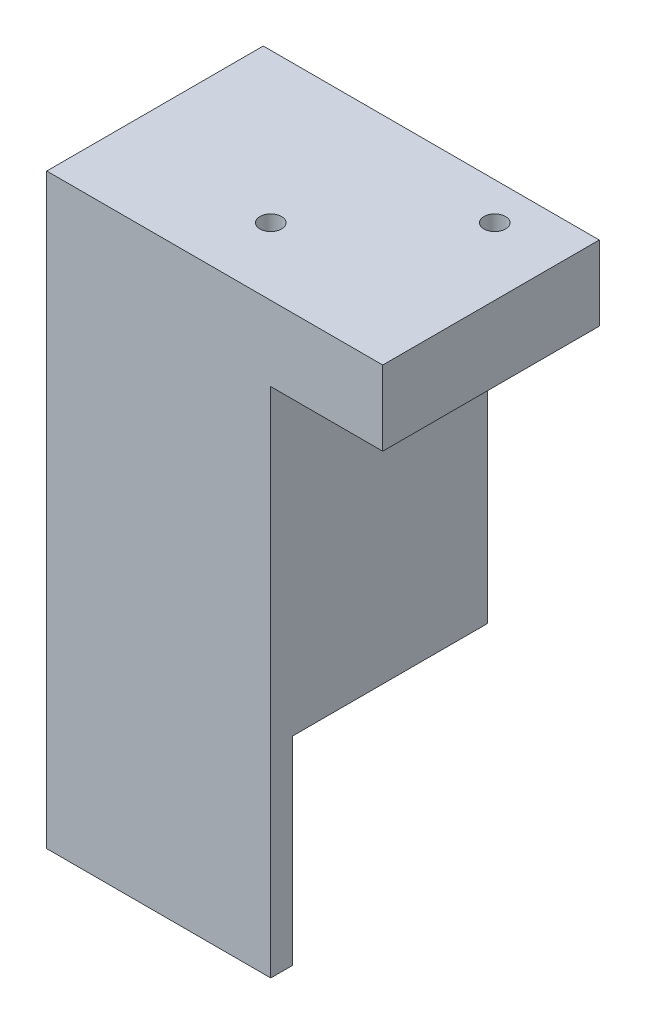
ISO-10303-21;
HEADER;
FILE_DESCRIPTION(('STEP AP214'),'2;1');
FILE_NAME('part.step','',(''),(''),'','','');
FILE_SCHEMA(('AUTOMOTIVE_DESIGN { 1 0 10303 214 1 1 1 1 }'));
ENDSEC;
DATA;
#1=APPLICATION_CONTEXT('core data for automotive mechanical design processes');
#2=APPLICATION_PROTOCOL_DEFINITION('international standard','automotive_design',2000,#1);
#3=PRODUCT_CONTEXT('',#1,'mechanical');
#4=PRODUCT('Part','Part','',(#3));
#5=PRODUCT_RELATED_PRODUCT_CATEGORY('part','',(#4));
#6=PRODUCT_DEFINITION_FORMATION('','',#4);
#7=PRODUCT_DEFINITION_CONTEXT('part definition',#1,'design');
#8=PRODUCT_DEFINITION('design','',#6,#7);
#9=PRODUCT_DEFINITION_SHAPE('','',#8);
#10=(LENGTH_UNIT() NAMED_UNIT(*) SI_UNIT(.MILLI.,.METRE.));
#11=(NAMED_UNIT(*) PLANE_ANGLE_UNIT() SI_UNIT($,.RADIAN.));
#12=(NAMED_UNIT(*) SI_UNIT($,.STERADIAN.) SOLID_ANGLE_UNIT());
#13=UNCERTAINTY_MEASURE_WITH_UNIT(LENGTH_MEASURE(1.E-05),#10,'distance_accuracy_value','');
#14=(GEOMETRIC_REPRESENTATION_CONTEXT(3) GLOBAL_UNCERTAINTY_ASSIGNED_CONTEXT((#13)) GLOBAL_UNIT_ASSIGNED_CONTEXT((#10,
#11,#12)) REPRESENTATION_CONTEXT('',''));
#15=CARTESIAN_POINT('',(0.,0.,0.));
#16=DIRECTION('',(0.,0.,1.));
#17=DIRECTION('',(1.,0.,0.));
#18=AXIS2_PLACEMENT_3D('',#15,#16,#17);
#19=CARTESIAN_POINT('',(0.,0.,-6.));
#20=DIRECTION('',(0.,0.,-1.));
#21=DIRECTION('',(1.,0.,0.));
#22=AXIS2_PLACEMENT_3D('',#19,#20,#21);
#23=PLANE('',#22);
#24=CARTESIAN_POINT('',(13.,40.,-6.));
#25=DIRECTION('',(0.,0.,1.));
#26=DIRECTION('',(1.,0.,0.));
#27=AXIS2_PLACEMENT_3D('',#24,#25,#26);
#28=CIRCLE('',#27,4.1);
#29=CARTESIAN_POINT('',(17.1,40.,-6.));
#30=VERTEX_POINT('',#29);
#31=EDGE_CURVE('E454',#30,#30,#28,.T.);
#32=ORIENTED_EDGE('',*,*,#31,.T.);
#33=EDGE_LOOP('',(#32));
#34=FACE_BOUND('',#33,.T.);
#35=DIRECTION('',(0.,-1.,0.));
#36=VECTOR('',#35,1.);
#37=CARTESIAN_POINT('',(0.,72.,-6.));
#38=LINE('',#37,#36);
#39=CARTESIAN_POINT('',(0.,72.,-6.));
#40=VERTEX_POINT('',#39);
#41=CARTESIAN_POINT('',(0.,-6.6,-6.));
#42=VERTEX_POINT('',#41);
#43=EDGE_CURVE('E354',#40,#42,#38,.T.);
#44=ORIENTED_EDGE('',*,*,#43,.F.);
#45=DIRECTION('',(-1.,0.,0.));
#46=VECTOR('',#45,1.);
#47=CARTESIAN_POINT('',(45.0000000000006,72.,-6.));
#48=LINE('',#47,#46);
#49=CARTESIAN_POINT('',(45.0000000000006,72.,-6.));
#50=VERTEX_POINT('',#49);
#51=EDGE_CURVE('E475',#50,#40,#48,.T.);
#52=ORIENTED_EDGE('',*,*,#51,.F.);
#53=DIRECTION('',(0.,1.,0.));
#54=VECTOR('',#53,1.);
#55=CARTESIAN_POINT('',(45.0000000000006,62.,-6.));
#56=LINE('',#55,#54);
#57=CARTESIAN_POINT('',(45.0000000000006,62.,-6.));
#58=VERTEX_POINT('',#57);
#59=EDGE_CURVE('E472',#58,#50,#56,.T.);
#60=ORIENTED_EDGE('',*,*,#59,.F.);
#61=DIRECTION('',(1.,0.,0.));
#62=VECTOR('',#61,1.);
#63=CARTESIAN_POINT('',(30.,62.,-6.));
#64=LINE('',#63,#62);
#65=CARTESIAN_POINT('',(30.,62.,-6.));
#66=VERTEX_POINT('',#65);
#67=EDGE_CURVE('E469',#66,#58,#64,.T.);
#68=ORIENTED_EDGE('',*,*,#67,.F.);
#69=DIRECTION('',(0.,1.,0.));
#70=VECTOR('',#69,1.);
#71=CARTESIAN_POINT('',(30.,20.,-6.));
#72=LINE('',#71,#70);
#73=CARTESIAN_POINT('',(30.,20.,-6.));
#74=VERTEX_POINT('',#73);
#75=EDGE_CURVE('E466',#74,#66,#72,.T.);
#76=ORIENTED_EDGE('',*,*,#75,.F.);
#77=DIRECTION('',(1.,0.,0.));
#78=VECTOR('',#77,1.);
#79=CARTESIAN_POINT('',(3.,20.,-6.));
#80=LINE('',#79,#78);
#81=CARTESIAN_POINT('',(2.9,20.,-6.));
#82=VERTEX_POINT('',#81);
#83=EDGE_CURVE('E463',#82,#74,#80,.T.);
#84=ORIENTED_EDGE('',*,*,#83,.F.);
#85=DIRECTION('',(0.,-1.,0.));
#86=VECTOR('',#85,1.);
#87=CARTESIAN_POINT('',(2.9,34.1003546051186,-6.));
#88=LINE('',#87,#86);
#89=CARTESIAN_POINT('',(2.9,-6.6,-6.));
#90=VERTEX_POINT('',#89);
#91=EDGE_CURVE('E421',#82,#90,#88,.T.);
#92=ORIENTED_EDGE('',*,*,#91,.T.);
#93=DIRECTION('',(-1.,0.,0.));
#94=VECTOR('',#93,1.);
#95=CARTESIAN_POINT('',(2.9,-6.6,-6.));
#96=LINE('',#95,#94);
#97=EDGE_CURVE('E356',#90,#42,#96,.T.);
#98=ORIENTED_EDGE('',*,*,#97,.T.);
#99=EDGE_LOOP('',(#44,#52,#60,#68,#76,#84,#92,#98));
#100=FACE_BOUND('',#99,.T.);
#101=ADVANCED_FACE('F43',(#34,#100),#23,.T.);
#102=CARTESIAN_POINT('',(13.,40.,6.));
#103=DIRECTION('',(0.,0.,-1.));
#104=DIRECTION('',(1.,0.,0.));
#105=AXIS2_PLACEMENT_3D('',#102,#103,#104);
#106=CYLINDRICAL_SURFACE('',#105,4.1);
#107=CARTESIAN_POINT('',(13.,40.,6.));
#108=DIRECTION('',(0.,0.,1.));
#109=DIRECTION('',(1.,0.,0.));
#110=AXIS2_PLACEMENT_3D('',#107,#108,#109);
#111=CIRCLE('',#110,4.1);
#112=CARTESIAN_POINT('',(17.1,40.,6.));
#113=VERTEX_POINT('',#112);
#114=EDGE_CURVE('E327',#113,#113,#111,.T.);
#115=ORIENTED_EDGE('',*,*,#114,.T.);
#116=EDGE_LOOP('',(#115));
#117=FACE_BOUND('',#116,.T.);
#118=ORIENTED_EDGE('',*,*,#31,.F.);
#119=EDGE_LOOP('',(#118));
#120=FACE_BOUND('',#119,.T.);
#121=ADVANCED_FACE('F595',(#117,#120),#106,.F.);
#122=CARTESIAN_POINT('',(13.,40.,6.));
#123=DIRECTION('',(0.,0.,-1.));
#124=DIRECTION('',(1.,0.,0.));
#125=AXIS2_PLACEMENT_3D('',#122,#123,#124);
#126=PLANE('',#125);
#127=ORIENTED_EDGE('',*,*,#114,.F.);
#128=EDGE_LOOP('',(#127));
#129=FACE_BOUND('',#128,.T.);
#130=ADVANCED_FACE('F601',(#129),#126,.T.);
#131=CARTESIAN_POINT('',(23.,-12.1313643090702,15.2999999996485));
#132=DIRECTION('',(0.,0.,1.));
#133=DIRECTION('',(-1.,0.,0.));
#134=AXIS2_PLACEMENT_3D('',#131,#132,#133);
#135=PLANE('',#134);
#136=DIRECTION('',(0.,1.,0.));
#137=VECTOR('',#136,1.);
#138=CARTESIAN_POINT('',(6.26715728747304,-12.1313643090702,15.2999999996485));
#139=LINE('',#138,#137);
#140=CARTESIAN_POINT('',(6.26715728747304,-6.6,15.2999999996485));
#141=VERTEX_POINT('',#140);
#142=CARTESIAN_POINT('',(6.26715728747304,20.,15.2999999996485));
#143=VERTEX_POINT('',#142);
#144=EDGE_CURVE('E494',#141,#143,#139,.T.);
#145=ORIENTED_EDGE('',*,*,#144,.T.);
#146=DIRECTION('',(-1.,0.,0.));
#147=VECTOR('',#146,1.);
#148=CARTESIAN_POINT('',(23.,20.,15.2999999996485));
#149=LINE('',#148,#147);
#150=CARTESIAN_POINT('',(4.69999999994772,20.,15.2999999996485));
#151=VERTEX_POINT('',#150);
#152=EDGE_CURVE('E261',#143,#151,#149,.T.);
#153=ORIENTED_EDGE('',*,*,#152,.T.);
#154=DIRECTION('',(0.,1.,0.));
#155=VECTOR('',#154,1.);
#156=CARTESIAN_POINT('',(4.69999999994772,-12.1313643090702,15.2999999996485));
#157=LINE('',#156,#155);
#158=CARTESIAN_POINT('',(4.69999999994772,-6.6,15.2999999996485));
#159=VERTEX_POINT('',#158);
#160=EDGE_CURVE('E274',#159,#151,#157,.T.);
#161=ORIENTED_EDGE('',*,*,#160,.F.);
#162=DIRECTION('',(1.,0.,0.));
#163=VECTOR('',#162,1.);
#164=CARTESIAN_POINT('',(4.69999999994772,-6.6,15.2999999996485));
#165=LINE('',#164,#163);
#166=EDGE_CURVE('E403',#159,#141,#165,.T.);
#167=ORIENTED_EDGE('',*,*,#166,.T.);
#168=EDGE_LOOP('',(#145,#153,#161,#167));
#169=FACE_BOUND('',#168,.T.);
#170=ADVANCED_FACE('F524',(#169),#135,.T.);
#171=CARTESIAN_POINT('',(10.7835786435609,-12.1313643090702,10.7835786435608));
#172=DIRECTION('',(0.707106781186544,0.,0.707106781186551));
#173=DIRECTION('',(-0.707106781186551,0.,0.707106781186544));
#174=AXIS2_PLACEMENT_3D('',#171,#172,#173);
#175=PLANE('',#174);
#176=DIRECTION('',(0.,1.,0.));
#177=VECTOR('',#176,1.);
#178=CARTESIAN_POINT('',(8.8999999999477,-12.1313643090702,12.6671572871739));
#179=LINE('',#178,#177);
#180=CARTESIAN_POINT('',(8.8999999999477,-6.6,12.6671572871739));
#181=VERTEX_POINT('',#180);
#182=CARTESIAN_POINT('',(8.8999999999477,20.,12.6671572871739));
#183=VERTEX_POINT('',#182);
#184=EDGE_CURVE('E497',#181,#183,#179,.T.);
#185=ORIENTED_EDGE('',*,*,#184,.T.);
#186=DIRECTION('',(-0.707106781186551,0.,0.707106781186544));
#187=VECTOR('',#186,1.);
#188=CARTESIAN_POINT('',(10.7835786435609,20.,10.7835786435608));
#189=LINE('',#188,#187);
#190=EDGE_CURVE('E266',#183,#143,#189,.T.);
#191=ORIENTED_EDGE('',*,*,#190,.T.);
#192=ORIENTED_EDGE('',*,*,#144,.F.);
#193=DIRECTION('',(0.70710678118655,0.,-0.707106781186545));
#194=VECTOR('',#193,1.);
#195=CARTESIAN_POINT('',(6.26715728747304,-6.6,15.2999999996485));
#196=LINE('',#195,#194);
#197=EDGE_CURVE('E406',#141,#181,#196,.T.);
#198=ORIENTED_EDGE('',*,*,#197,.T.);
#199=EDGE_LOOP('',(#185,#191,#192,#198));
#200=FACE_BOUND('',#199,.T.);
#201=ADVANCED_FACE('F522',(#200),#175,.T.);
#202=CARTESIAN_POINT('',(8.8999999999477,-12.1313643090702,23.));
#203=DIRECTION('',(1.,0.,0.));
#204=DIRECTION('',(0.,0.,1.));
#205=AXIS2_PLACEMENT_3D('',#202,#203,#204);
#206=PLANE('',#205);
#207=DIRECTION('',(0.,1.,0.));
#208=VECTOR('',#207,1.);
#209=CARTESIAN_POINT('',(8.8999999999477,-12.1313643090702,7.33284271212317));
#210=LINE('',#209,#208);
#211=CARTESIAN_POINT('',(8.8999999999477,-6.6,7.33284271212316));
#212=VERTEX_POINT('',#211);
#213=CARTESIAN_POINT('',(8.8999999999477,20.,7.33284271212317));
#214=VERTEX_POINT('',#213);
#215=EDGE_CURVE('E500',#212,#214,#210,.T.);
#216=ORIENTED_EDGE('',*,*,#215,.T.);
#217=DIRECTION('',(0.,0.,1.));
#218=VECTOR('',#217,1.);
#219=CARTESIAN_POINT('',(8.8999999999477,20.,23.));
#220=LINE('',#219,#218);
#221=EDGE_CURVE('E488',#214,#183,#220,.T.);
#222=ORIENTED_EDGE('',*,*,#221,.T.);
#223=ORIENTED_EDGE('',*,*,#184,.F.);
#224=DIRECTION('',(0.,0.,-1.));
#225=VECTOR('',#224,1.);
#226=CARTESIAN_POINT('',(8.8999999999477,-6.6,12.6671572871739));
#227=LINE('',#226,#225);
#228=EDGE_CURVE('E409',#181,#212,#227,.T.);
#229=ORIENTED_EDGE('',*,*,#228,.T.);
#230=EDGE_LOOP('',(#216,#222,#223,#229));
#231=FACE_BOUND('',#230,.T.);
#232=ADVANCED_FACE('F518',(#231),#206,.T.);
#233=CARTESIAN_POINT('',(23.7835786439122,-12.1313643090702,22.2164213560878));
#234=DIRECTION('',(0.707106781186551,0.,-0.707106781186544));
#235=DIRECTION('',(0.707106781186544,0.,0.707106781186551));
#236=AXIS2_PLACEMENT_3D('',#233,#234,#235);
#237=PLANE('',#236);
#238=DIRECTION('',(0.,1.,0.));
#239=VECTOR('',#238,1.);
#240=CARTESIAN_POINT('',(6.26715728747308,-12.1313643090702,4.69999999964852));
#241=LINE('',#240,#239);
#242=CARTESIAN_POINT('',(6.26715728747308,-6.6,4.69999999964852));
#243=VERTEX_POINT('',#242);
#244=CARTESIAN_POINT('',(6.26715728747308,20.,4.69999999964852));
#245=VERTEX_POINT('',#244);
#246=EDGE_CURVE('E263',#243,#245,#241,.T.);
#247=ORIENTED_EDGE('',*,*,#246,.T.);
#248=DIRECTION('',(0.707106781186545,0.,0.707106781186551));
#249=VECTOR('',#248,1.);
#250=CARTESIAN_POINT('',(23.7835786439122,20.,22.2164213560878));
#251=LINE('',#250,#249);
#252=EDGE_CURVE('E486',#245,#214,#251,.T.);
#253=ORIENTED_EDGE('',*,*,#252,.T.);
#254=ORIENTED_EDGE('',*,*,#215,.F.);
#255=DIRECTION('',(-0.707106781186545,0.,-0.70710678118655));
#256=VECTOR('',#255,1.);
#257=CARTESIAN_POINT('',(8.8999999999477,-6.6,7.33284271212316));
#258=LINE('',#257,#256);
#259=EDGE_CURVE('E412',#212,#243,#258,.T.);
#260=ORIENTED_EDGE('',*,*,#259,.T.);
#261=EDGE_LOOP('',(#247,#253,#254,#260));
#262=FACE_BOUND('',#261,.T.);
#263=ADVANCED_FACE('F505',(#262),#237,.T.);
#264=CARTESIAN_POINT('',(23.,-12.1313643090702,4.69999999964853));
#265=DIRECTION('',(0.,0.,-1.));
#266=DIRECTION('',(1.,0.,0.));
#267=AXIS2_PLACEMENT_3D('',#264,#265,#266);
#268=PLANE('',#267);
#269=DIRECTION('',(0.,1.,0.));
#270=VECTOR('',#269,1.);
#271=CARTESIAN_POINT('',(4.69999999994772,-12.1313643090702,4.69999999964852));
#272=LINE('',#271,#270);
#273=CARTESIAN_POINT('',(4.69999999994772,-6.6,4.69999999964852));
#274=VERTEX_POINT('',#273);
#275=CARTESIAN_POINT('',(4.69999999994772,20.,4.69999999964852));
#276=VERTEX_POINT('',#275);
#277=EDGE_CURVE('E255',#274,#276,#272,.T.);
#278=ORIENTED_EDGE('',*,*,#277,.T.);
#279=DIRECTION('',(1.,0.,0.));
#280=VECTOR('',#279,1.);
#281=CARTESIAN_POINT('',(23.,20.,4.69999999964853));
#282=LINE('',#281,#280);
#283=EDGE_CURVE('E484',#276,#245,#282,.T.);
#284=ORIENTED_EDGE('',*,*,#283,.T.);
#285=ORIENTED_EDGE('',*,*,#246,.F.);
#286=DIRECTION('',(-1.,0.,0.));
#287=VECTOR('',#286,1.);
#288=CARTESIAN_POINT('',(6.26715728747308,-6.6,4.69999999964852));
#289=LINE('',#288,#287);
#290=EDGE_CURVE('E415',#243,#274,#289,.T.);
#291=ORIENTED_EDGE('',*,*,#290,.T.);
#292=EDGE_LOOP('',(#278,#284,#285,#291));
#293=FACE_BOUND('',#292,.T.);
#294=ADVANCED_FACE('F510',(#293),#268,.T.);
#295=CARTESIAN_POINT('',(4.69999999994772,-12.1313643090702,23.));
#296=DIRECTION('',(-1.,0.,0.));
#297=DIRECTION('',(0.,0.,-1.));
#298=AXIS2_PLACEMENT_3D('',#295,#296,#297);
#299=PLANE('',#298);
#300=DIRECTION('',(0.,1.,0.));
#301=VECTOR('',#300,1.);
#302=CARTESIAN_POINT('',(4.69999999994772,-12.1313643090702,7.09999999964851));
#303=LINE('',#302,#301);
#304=CARTESIAN_POINT('',(4.69999999994772,-6.6,7.09999999964851));
#305=VERTEX_POINT('',#304);
#306=CARTESIAN_POINT('',(4.69999999994772,20.,7.09999999964851));
#307=VERTEX_POINT('',#306);
#308=EDGE_CURVE('E253',#305,#307,#303,.T.);
#309=ORIENTED_EDGE('',*,*,#308,.T.);
#310=DIRECTION('',(0.,0.,-1.));
#311=VECTOR('',#310,1.);
#312=CARTESIAN_POINT('',(4.69999999994772,20.,23.));
#313=LINE('',#312,#311);
#314=EDGE_CURVE('E482',#307,#276,#313,.T.);
#315=ORIENTED_EDGE('',*,*,#314,.T.);
#316=ORIENTED_EDGE('',*,*,#277,.F.);
#317=DIRECTION('',(0.,0.,1.));
#318=VECTOR('',#317,1.);
#319=CARTESIAN_POINT('',(4.69999999994772,-6.6,4.69999999964852));
#320=LINE('',#319,#318);
#321=EDGE_CURVE('E240',#274,#305,#320,.T.);
#322=ORIENTED_EDGE('',*,*,#321,.T.);
#323=EDGE_LOOP('',(#309,#315,#316,#322));
#324=FACE_BOUND('',#323,.T.);
#325=ADVANCED_FACE('F252',(#324),#299,.T.);
#326=CARTESIAN_POINT('',(23.,-12.1313643090702,7.09999999964852));
#327=DIRECTION('',(0.,0.,-1.));
#328=DIRECTION('',(1.,0.,0.));
#329=AXIS2_PLACEMENT_3D('',#326,#327,#328);
#330=PLANE('',#329);
#331=DIRECTION('',(1.,0.,0.));
#332=VECTOR('',#331,1.);
#333=CARTESIAN_POINT('',(23.,20.,7.09999999964852));
#334=LINE('',#333,#332);
#335=CARTESIAN_POINT('',(2.9,20.,7.09999999957954));
#336=VERTEX_POINT('',#335);
#337=EDGE_CURVE('E259',#336,#307,#334,.T.);
#338=ORIENTED_EDGE('',*,*,#337,.T.);
#339=ORIENTED_EDGE('',*,*,#308,.F.);
#340=DIRECTION('',(-1.,0.,-3.83195597178084E-11));
#341=VECTOR('',#340,1.);
#342=CARTESIAN_POINT('',(4.69999999994772,-6.6,7.09999999964851));
#343=LINE('',#342,#341);
#344=CARTESIAN_POINT('',(2.9,-6.6,7.09999999957954));
#345=VERTEX_POINT('',#344);
#346=EDGE_CURVE('E237',#305,#345,#343,.T.);
#347=ORIENTED_EDGE('',*,*,#346,.T.);
#348=DIRECTION('',(0.,-1.,0.));
#349=VECTOR('',#348,1.);
#350=CARTESIAN_POINT('',(2.9,34.1003546051186,7.09999999957954));
#351=LINE('',#350,#349);
#352=EDGE_CURVE('E424',#336,#345,#351,.T.);
#353=ORIENTED_EDGE('',*,*,#352,.F.);
#354=EDGE_LOOP('',(#338,#339,#347,#353));
#355=FACE_BOUND('',#354,.T.);
#356=ADVANCED_FACE('F257',(#355),#330,.T.);
#357=CARTESIAN_POINT('',(15.9000000003515,-12.1313643090702,0.));
#358=DIRECTION('',(-1.,0.,0.));
#359=DIRECTION('',(0.,0.,-1.));
#360=AXIS2_PLACEMENT_3D('',#357,#358,#359);
#361=PLANE('',#360);
#362=DIRECTION('',(0.,1.,0.));
#363=VECTOR('',#362,1.);
#364=CARTESIAN_POINT('',(15.9000000003515,-12.1313643090702,18.3000000000523));
#365=LINE('',#364,#363);
#366=CARTESIAN_POINT('',(15.9000000003515,-6.6,18.3000000000523));
#367=VERTEX_POINT('',#366);
#368=CARTESIAN_POINT('',(15.9000000003515,20.,18.3000000000523));
#369=VERTEX_POINT('',#368);
#370=EDGE_CURVE('E297',#367,#369,#365,.T.);
#371=ORIENTED_EDGE('',*,*,#370,.T.);
#372=DIRECTION('',(0.,0.,-1.));
#373=VECTOR('',#372,1.);
#374=CARTESIAN_POINT('',(15.9000000003515,20.,0.));
#375=LINE('',#374,#373);
#376=CARTESIAN_POINT('',(15.9000000004205,20.,20.1));
#377=VERTEX_POINT('',#376);
#378=EDGE_CURVE('E298',#377,#369,#375,.T.);
#379=ORIENTED_EDGE('',*,*,#378,.F.);
#380=DIRECTION('',(0.,-1.,0.));
#381=VECTOR('',#380,1.);
#382=CARTESIAN_POINT('',(15.9000000004205,34.1003546051186,20.1));
#383=LINE('',#382,#381);
#384=CARTESIAN_POINT('',(15.9000000004205,-6.6,20.1));
#385=VERTEX_POINT('',#384);
#386=EDGE_CURVE('E427',#377,#385,#383,.T.);
#387=ORIENTED_EDGE('',*,*,#386,.T.);
#388=DIRECTION('',(-3.83181141149118E-11,0.,-1.));
#389=VECTOR('',#388,1.);
#390=CARTESIAN_POINT('',(15.9000000004205,-6.6,20.1));
#391=LINE('',#390,#389);
#392=EDGE_CURVE('E366',#385,#367,#391,.T.);
#393=ORIENTED_EDGE('',*,*,#392,.T.);
#394=EDGE_LOOP('',(#371,#379,#387,#393));
#395=FACE_BOUND('',#394,.T.);
#396=ADVANCED_FACE('F560',(#395),#361,.F.);
#397=CARTESIAN_POINT('',(0.,-12.1313643090702,18.3000000000523));
#398=DIRECTION('',(0.,0.,-1.));
#399=DIRECTION('',(1.,0.,0.));
#400=AXIS2_PLACEMENT_3D('',#397,#398,#399);
#401=PLANE('',#400);
#402=DIRECTION('',(0.,1.,0.));
#403=VECTOR('',#402,1.);
#404=CARTESIAN_POINT('',(18.3000000003515,-12.1313643090702,18.3000000000523));
#405=LINE('',#404,#403);
#406=CARTESIAN_POINT('',(18.3000000003515,-6.6,18.3000000000523));
#407=VERTEX_POINT('',#406);
#408=CARTESIAN_POINT('',(18.3000000003515,20.,18.3000000000523));
#409=VERTEX_POINT('',#408);
#410=EDGE_CURVE('E295',#407,#409,#405,.T.);
#411=ORIENTED_EDGE('',*,*,#410,.T.);
#412=DIRECTION('',(1.,0.,0.));
#413=VECTOR('',#412,1.);
#414=CARTESIAN_POINT('',(0.,20.,18.3000000000523));
#415=LINE('',#414,#413);
#416=EDGE_CURVE('E66',#369,#409,#415,.T.);
#417=ORIENTED_EDGE('',*,*,#416,.F.);
#418=ORIENTED_EDGE('',*,*,#370,.F.);
#419=DIRECTION('',(1.,0.,0.));
#420=VECTOR('',#419,1.);
#421=CARTESIAN_POINT('',(15.9000000003515,-6.6,18.3000000000523));
#422=LINE('',#421,#420);
#423=EDGE_CURVE('E369',#367,#407,#422,.T.);
#424=ORIENTED_EDGE('',*,*,#423,.T.);
#425=EDGE_LOOP('',(#411,#417,#418,#424));
#426=FACE_BOUND('',#425,.T.);
#427=ADVANCED_FACE('F557',(#426),#401,.F.);
#428=CARTESIAN_POINT('',(18.3000000003515,-12.1313643090702,0.));
#429=DIRECTION('',(-1.,0.,0.));
#430=DIRECTION('',(0.,0.,-1.));
#431=AXIS2_PLACEMENT_3D('',#428,#429,#430);
#432=PLANE('',#431);
#433=DIRECTION('',(0.,1.,0.));
#434=VECTOR('',#433,1.);
#435=CARTESIAN_POINT('',(18.3000000003515,-12.1313643090702,16.7328427125269));
#436=LINE('',#435,#434);
#437=CARTESIAN_POINT('',(18.3000000003515,-6.6,16.7328427125269));
#438=VERTEX_POINT('',#437);
#439=CARTESIAN_POINT('',(18.3000000003515,20.,16.7328427125269));
#440=VERTEX_POINT('',#439);
#441=EDGE_CURVE('E291',#438,#440,#436,.T.);
#442=ORIENTED_EDGE('',*,*,#441,.T.);
#443=DIRECTION('',(0.,0.,-1.));
#444=VECTOR('',#443,1.);
#445=CARTESIAN_POINT('',(18.3000000003515,20.,0.));
#446=LINE('',#445,#444);
#447=EDGE_CURVE('E292',#409,#440,#446,.T.);
#448=ORIENTED_EDGE('',*,*,#447,.F.);
#449=ORIENTED_EDGE('',*,*,#410,.F.);
#450=DIRECTION('',(0.,0.,-1.));
#451=VECTOR('',#450,1.);
#452=CARTESIAN_POINT('',(18.3000000003515,-6.6,18.3000000000523));
#453=LINE('',#452,#451);
#454=EDGE_CURVE('E372',#407,#438,#453,.T.);
#455=ORIENTED_EDGE('',*,*,#454,.T.);
#456=EDGE_LOOP('',(#442,#448,#449,#455));
#457=FACE_BOUND('',#456,.T.);
#458=ADVANCED_FACE('F556',(#457),#432,.F.);
#459=CARTESIAN_POINT('',(0.783578643912206,-12.1313643090702,-0.783578643912212));
#460=DIRECTION('',(-0.707106781186545,0.,0.70710678118655));
#461=DIRECTION('',(-0.70710678118655,0.,-0.707106781186545));
#462=AXIS2_PLACEMENT_3D('',#459,#460,#461);
#463=PLANE('',#462);
#464=DIRECTION('',(0.,1.,0.));
#465=VECTOR('',#464,1.);
#466=CARTESIAN_POINT('',(15.6671572878768,-12.1313643090702,14.1000000000523));
#467=LINE('',#466,#465);
#468=CARTESIAN_POINT('',(15.6671572878768,-6.6,14.1000000000523));
#469=VERTEX_POINT('',#468);
#470=CARTESIAN_POINT('',(15.6671572878768,20.,14.1000000000523));
#471=VERTEX_POINT('',#470);
#472=EDGE_CURVE('E287',#469,#471,#467,.T.);
#473=ORIENTED_EDGE('',*,*,#472,.T.);
#474=DIRECTION('',(-0.70710678118655,0.,-0.707106781186545));
#475=VECTOR('',#474,1.);
#476=CARTESIAN_POINT('',(0.783578643912206,20.,-0.783578643912212));
#477=LINE('',#476,#475);
#478=EDGE_CURVE('E288',#440,#471,#477,.T.);
#479=ORIENTED_EDGE('',*,*,#478,.F.);
#480=ORIENTED_EDGE('',*,*,#441,.F.);
#481=DIRECTION('',(-0.70710678118655,0.,-0.707106781186545));
#482=VECTOR('',#481,1.);
#483=CARTESIAN_POINT('',(18.3000000003515,-6.6,16.7328427125269));
#484=LINE('',#483,#482);
#485=EDGE_CURVE('E375',#438,#469,#484,.T.);
#486=ORIENTED_EDGE('',*,*,#485,.T.);
#487=EDGE_LOOP('',(#473,#479,#480,#486));
#488=FACE_BOUND('',#487,.T.);
#489=ADVANCED_FACE('F552',(#488),#463,.F.);
#490=CARTESIAN_POINT('',(0.,-12.1313643090702,14.1000000000523));
#491=DIRECTION('',(0.,0.,1.));
#492=DIRECTION('',(-1.,0.,0.));
#493=AXIS2_PLACEMENT_3D('',#490,#491,#492);
#494=PLANE('',#493);
#495=DIRECTION('',(0.,1.,0.));
#496=VECTOR('',#495,1.);
#497=CARTESIAN_POINT('',(10.3328427128261,-12.1313643090702,14.1000000000523));
#498=LINE('',#497,#496);
#499=CARTESIAN_POINT('',(10.3328427128261,-6.6,14.1000000000523));
#500=VERTEX_POINT('',#499);
#501=CARTESIAN_POINT('',(10.3328427128261,20.,14.1000000000523));
#502=VERTEX_POINT('',#501);
#503=EDGE_CURVE('E283',#500,#502,#498,.T.);
#504=ORIENTED_EDGE('',*,*,#503,.T.);
#505=DIRECTION('',(-1.,0.,0.));
#506=VECTOR('',#505,1.);
#507=CARTESIAN_POINT('',(0.,20.,14.1000000000523));
#508=LINE('',#507,#506);
#509=EDGE_CURVE('E284',#471,#502,#508,.T.);
#510=ORIENTED_EDGE('',*,*,#509,.F.);
#511=ORIENTED_EDGE('',*,*,#472,.F.);
#512=DIRECTION('',(-1.,0.,0.));
#513=VECTOR('',#512,1.);
#514=CARTESIAN_POINT('',(15.6671572878768,-6.6,14.1000000000523));
#515=LINE('',#514,#513);
#516=EDGE_CURVE('E378',#469,#500,#515,.T.);
#517=ORIENTED_EDGE('',*,*,#516,.T.);
#518=EDGE_LOOP('',(#504,#510,#511,#517));
#519=FACE_BOUND('',#518,.T.);
#520=ADVANCED_FACE('F550',(#519),#494,.F.);
#521=CARTESIAN_POINT('',(12.2164213564392,-12.1313643090702,12.2164213564391));
#522=DIRECTION('',(0.70710678118655,0.,0.707106781186545));
#523=DIRECTION('',(-0.707106781186545,0.,0.70710678118655));
#524=AXIS2_PLACEMENT_3D('',#521,#522,#523);
#525=PLANE('',#524);
#526=DIRECTION('',(0.,1.,0.));
#527=VECTOR('',#526,1.);
#528=CARTESIAN_POINT('',(7.70000000035147,-12.1313643090702,16.732842712527));
#529=LINE('',#528,#527);
#530=CARTESIAN_POINT('',(7.70000000035147,-6.6,16.732842712527));
#531=VERTEX_POINT('',#530);
#532=CARTESIAN_POINT('',(7.70000000035147,20.,16.732842712527));
#533=VERTEX_POINT('',#532);
#534=EDGE_CURVE('E279',#531,#533,#529,.T.);
#535=ORIENTED_EDGE('',*,*,#534,.T.);
#536=DIRECTION('',(-0.707106781186545,0.,0.70710678118655));
#537=VECTOR('',#536,1.);
#538=CARTESIAN_POINT('',(12.2164213564392,20.,12.2164213564391));
#539=LINE('',#538,#537);
#540=EDGE_CURVE('E280',#502,#533,#539,.T.);
#541=ORIENTED_EDGE('',*,*,#540,.F.);
#542=ORIENTED_EDGE('',*,*,#503,.F.);
#543=DIRECTION('',(-0.707106781186545,0.,0.70710678118655));
#544=VECTOR('',#543,1.);
#545=CARTESIAN_POINT('',(10.3328427128261,-6.6,14.1000000000523));
#546=LINE('',#545,#544);
#547=EDGE_CURVE('E381',#500,#531,#546,.T.);
#548=ORIENTED_EDGE('',*,*,#547,.T.);
#549=EDGE_LOOP('',(#535,#541,#542,#548));
#550=FACE_BOUND('',#549,.T.);
#551=ADVANCED_FACE('F546',(#550),#525,.F.);
#552=CARTESIAN_POINT('',(7.70000000035147,-12.1313643090702,0.));
#553=DIRECTION('',(1.,0.,0.));
#554=DIRECTION('',(0.,0.,1.));
#555=AXIS2_PLACEMENT_3D('',#552,#553,#554);
#556=PLANE('',#555);
#557=DIRECTION('',(0.,1.,0.));
#558=VECTOR('',#557,1.);
#559=CARTESIAN_POINT('',(7.70000000035147,-12.1313643090702,18.3000000000523));
#560=LINE('',#559,#558);
#561=CARTESIAN_POINT('',(7.70000000035147,-6.6,18.3000000000523));
#562=VERTEX_POINT('',#561);
#563=CARTESIAN_POINT('',(7.70000000035147,20.,18.3000000000523));
#564=VERTEX_POINT('',#563);
#565=EDGE_CURVE('E273',#562,#564,#560,.T.);
#566=ORIENTED_EDGE('',*,*,#565,.T.);
#567=DIRECTION('',(0.,0.,1.));
#568=VECTOR('',#567,1.);
#569=CARTESIAN_POINT('',(7.70000000035147,20.,0.));
#570=LINE('',#569,#568);
#571=EDGE_CURVE('E275',#533,#564,#570,.T.);
#572=ORIENTED_EDGE('',*,*,#571,.F.);
#573=ORIENTED_EDGE('',*,*,#534,.F.);
#574=DIRECTION('',(0.,0.,1.));
#575=VECTOR('',#574,1.);
#576=CARTESIAN_POINT('',(7.70000000035147,-6.6,16.732842712527));
#577=LINE('',#576,#575);
#578=EDGE_CURVE('E384',#531,#562,#577,.T.);
#579=ORIENTED_EDGE('',*,*,#578,.T.);
#580=EDGE_LOOP('',(#566,#572,#573,#579));
#581=FACE_BOUND('',#580,.T.);
#582=ADVANCED_FACE('F544',(#581),#556,.F.);
#583=CARTESIAN_POINT('',(0.,-12.1313643090702,18.3000000000523));
#584=DIRECTION('',(0.,0.,-1.));
#585=DIRECTION('',(1.,0.,0.));
#586=AXIS2_PLACEMENT_3D('',#583,#584,#585);
#587=PLANE('',#586);
#588=DIRECTION('',(0.,1.,0.));
#589=VECTOR('',#588,1.);
#590=CARTESIAN_POINT('',(10.1000000003515,-12.1313643090702,18.3000000000523));
#591=LINE('',#590,#589);
#592=CARTESIAN_POINT('',(10.1000000003515,-6.6,18.3000000000523));
#593=VERTEX_POINT('',#592);
#594=CARTESIAN_POINT('',(10.1000000003515,20.,18.3000000000523));
#595=VERTEX_POINT('',#594);
#596=EDGE_CURVE('E301',#593,#595,#591,.T.);
#597=ORIENTED_EDGE('',*,*,#596,.T.);
#598=DIRECTION('',(1.,0.,0.));
#599=VECTOR('',#598,1.);
#600=CARTESIAN_POINT('',(0.,20.,18.3000000000523));
#601=LINE('',#600,#599);
#602=EDGE_CURVE('E302',#564,#595,#601,.T.);
#603=ORIENTED_EDGE('',*,*,#602,.F.);
#604=ORIENTED_EDGE('',*,*,#565,.F.);
#605=DIRECTION('',(1.,0.,0.));
#606=VECTOR('',#605,1.);
#607=CARTESIAN_POINT('',(7.70000000035147,-6.6,18.3000000000523));
#608=LINE('',#607,#606);
#609=EDGE_CURVE('E387',#562,#593,#608,.T.);
#610=ORIENTED_EDGE('',*,*,#609,.T.);
#611=EDGE_LOOP('',(#597,#603,#604,#610));
#612=FACE_BOUND('',#611,.T.);
#613=ADVANCED_FACE('F541',(#612),#587,.F.);
#614=CARTESIAN_POINT('',(10.1000000003515,-12.1313643090702,0.));
#615=DIRECTION('',(1.,0.,0.));
#616=DIRECTION('',(0.,0.,1.));
#617=AXIS2_PLACEMENT_3D('',#614,#615,#616);
#618=PLANE('',#617);
#619=DIRECTION('',(0.,-1.,0.));
#620=VECTOR('',#619,1.);
#621=CARTESIAN_POINT('',(10.1000000003515,34.1003546051186,20.1));
#622=LINE('',#621,#620);
#623=CARTESIAN_POINT('',(10.1000000003515,20.,20.1));
#624=VERTEX_POINT('',#623);
#625=CARTESIAN_POINT('',(10.1000000003515,-6.6,20.1));
#626=VERTEX_POINT('',#625);
#627=EDGE_CURVE('E433',#624,#626,#622,.T.);
#628=ORIENTED_EDGE('',*,*,#627,.F.);
#629=DIRECTION('',(0.,0.,1.));
#630=VECTOR('',#629,1.);
#631=CARTESIAN_POINT('',(10.1000000003515,20.,0.));
#632=LINE('',#631,#630);
#633=EDGE_CURVE('E58',#595,#624,#632,.T.);
#634=ORIENTED_EDGE('',*,*,#633,.F.);
#635=ORIENTED_EDGE('',*,*,#596,.F.);
#636=DIRECTION('',(0.,0.,1.));
#637=VECTOR('',#636,1.);
#638=CARTESIAN_POINT('',(10.1000000003515,-6.6,18.3000000000523));
#639=LINE('',#638,#637);
#640=EDGE_CURVE('E390',#593,#626,#639,.T.);
#641=ORIENTED_EDGE('',*,*,#640,.T.);
#642=EDGE_LOOP('',(#628,#634,#635,#641));
#643=FACE_BOUND('',#642,.T.);
#644=ADVANCED_FACE('F537',(#643),#618,.F.);
#645=CARTESIAN_POINT('',(23.,-12.1313643090702,12.8999999996485));
#646=DIRECTION('',(0.,0.,1.));
#647=DIRECTION('',(-1.,0.,0.));
#648=AXIS2_PLACEMENT_3D('',#645,#646,#647);
#649=PLANE('',#648);
#650=DIRECTION('',(0.,1.,0.));
#651=VECTOR('',#650,1.);
#652=CARTESIAN_POINT('',(4.69999999994772,-12.1313643090702,12.8999999996485));
#653=LINE('',#652,#651);
#654=CARTESIAN_POINT('',(4.69999999994772,-6.6,12.8999999996485));
#655=VERTEX_POINT('',#654);
#656=CARTESIAN_POINT('',(4.69999999994772,20.,12.8999999996485));
#657=VERTEX_POINT('',#656);
#658=EDGE_CURVE('E270',#655,#657,#653,.T.);
#659=ORIENTED_EDGE('',*,*,#658,.T.);
#660=DIRECTION('',(-1.,0.,0.));
#661=VECTOR('',#660,1.);
#662=CARTESIAN_POINT('',(23.,20.,12.8999999996485));
#663=LINE('',#662,#661);
#664=CARTESIAN_POINT('',(2.9,20.,12.8999999996485));
#665=VERTEX_POINT('',#664);
#666=EDGE_CURVE('E478',#657,#665,#663,.T.);
#667=ORIENTED_EDGE('',*,*,#666,.T.);
#668=DIRECTION('',(0.,-1.,0.));
#669=VECTOR('',#668,1.);
#670=CARTESIAN_POINT('',(2.9,34.1003546051186,12.8999999996485));
#671=LINE('',#670,#669);
#672=CARTESIAN_POINT('',(2.9,-6.6,12.8999999996485));
#673=VERTEX_POINT('',#672);
#674=EDGE_CURVE('E435',#665,#673,#671,.T.);
#675=ORIENTED_EDGE('',*,*,#674,.T.);
#676=DIRECTION('',(1.,0.,0.));
#677=VECTOR('',#676,1.);
#678=CARTESIAN_POINT('',(2.9,-6.6,12.8999999996485));
#679=LINE('',#678,#677);
#680=EDGE_CURVE('E398',#673,#655,#679,.T.);
#681=ORIENTED_EDGE('',*,*,#680,.T.);
#682=EDGE_LOOP('',(#659,#667,#675,#681));
#683=FACE_BOUND('',#682,.T.);
#684=ADVANCED_FACE('F530',(#683),#649,.T.);
#685=CARTESIAN_POINT('',(4.69999999994772,-12.1313643090702,23.));
#686=DIRECTION('',(-1.,0.,0.));
#687=DIRECTION('',(0.,0.,-1.));
#688=AXIS2_PLACEMENT_3D('',#685,#686,#687);
#689=PLANE('',#688);
#690=ORIENTED_EDGE('',*,*,#160,.T.);
#691=DIRECTION('',(0.,0.,-1.));
#692=VECTOR('',#691,1.);
#693=CARTESIAN_POINT('',(4.69999999994772,20.,23.));
#694=LINE('',#693,#692);
#695=EDGE_CURVE('E477',#151,#657,#694,.T.);
#696=ORIENTED_EDGE('',*,*,#695,.T.);
#697=ORIENTED_EDGE('',*,*,#658,.F.);
#698=DIRECTION('',(0.,0.,1.));
#699=VECTOR('',#698,1.);
#700=CARTESIAN_POINT('',(4.69999999994772,-6.6,12.8999999996485));
#701=LINE('',#700,#699);
#702=EDGE_CURVE('E401',#655,#159,#701,.T.);
#703=ORIENTED_EDGE('',*,*,#702,.T.);
#704=EDGE_LOOP('',(#690,#696,#697,#703));
#705=FACE_BOUND('',#704,.T.);
#706=ADVANCED_FACE('F532',(#705),#689,.T.);
#707=CARTESIAN_POINT('',(0.,72.,23.));
#708=DIRECTION('',(0.,0.,-1.));
#709=DIRECTION('',(1.,0.,0.));
#710=AXIS2_PLACEMENT_3D('',#707,#708,#709);
#711=PLANE('',#710);
#712=DIRECTION('',(0.,-1.,0.));
#713=VECTOR('',#712,1.);
#714=CARTESIAN_POINT('',(30.,72.,23.));
#715=LINE('',#714,#713);
#716=CARTESIAN_POINT('',(30.,62.,23.));
#717=VERTEX_POINT('',#716);
#718=CARTESIAN_POINT('',(30.,-6.6,23.));
#719=VERTEX_POINT('',#718);
#720=EDGE_CURVE('E11',#717,#719,#715,.T.);
#721=ORIENTED_EDGE('',*,*,#720,.F.);
#722=DIRECTION('',(-1.,0.,0.));
#723=VECTOR('',#722,1.);
#724=CARTESIAN_POINT('',(30.,62.,23.));
#725=LINE('',#724,#723);
#726=CARTESIAN_POINT('',(45.0000000000006,62.,23.));
#727=VERTEX_POINT('',#726);
#728=EDGE_CURVE('E321',#727,#717,#725,.T.);
#729=ORIENTED_EDGE('',*,*,#728,.F.);
#730=DIRECTION('',(0.,-1.,0.));
#731=VECTOR('',#730,1.);
#732=CARTESIAN_POINT('',(45.0000000000006,72.,23.));
#733=LINE('',#732,#731);
#734=CARTESIAN_POINT('',(45.0000000000006,72.,23.));
#735=VERTEX_POINT('',#734);
#736=EDGE_CURVE('E278',#735,#727,#733,.T.);
#737=ORIENTED_EDGE('',*,*,#736,.F.);
#738=DIRECTION('',(-1.,0.,0.));
#739=VECTOR('',#738,1.);
#740=CARTESIAN_POINT('',(0.,72.,23.));
#741=LINE('',#740,#739);
#742=CARTESIAN_POINT('',(0.,72.,23.));
#743=VERTEX_POINT('',#742);
#744=EDGE_CURVE('E337',#735,#743,#741,.T.);
#745=ORIENTED_EDGE('',*,*,#744,.T.);
#746=DIRECTION('',(0.,-1.,0.));
#747=VECTOR('',#746,1.);
#748=CARTESIAN_POINT('',(0.,72.,23.));
#749=LINE('',#748,#747);
#750=CARTESIAN_POINT('',(0.,-6.6,23.));
#751=VERTEX_POINT('',#750);
#752=EDGE_CURVE('E51',#743,#751,#749,.T.);
#753=ORIENTED_EDGE('',*,*,#752,.T.);
#754=DIRECTION('',(1.,0.,0.));
#755=VECTOR('',#754,1.);
#756=CARTESIAN_POINT('',(0.,-6.6,23.));
#757=LINE('',#756,#755);
#758=EDGE_CURVE('E346',#751,#719,#757,.T.);
#759=ORIENTED_EDGE('',*,*,#758,.T.);
#760=EDGE_LOOP('',(#721,#729,#737,#745,#753,#759));
#761=FACE_BOUND('',#760,.T.);
#762=ADVANCED_FACE('F344',(#761),#711,.F.);
#763=CARTESIAN_POINT('',(0.,72.,0.));
#764=DIRECTION('',(1.,0.,0.));
#765=DIRECTION('',(0.,0.,1.));
#766=AXIS2_PLACEMENT_3D('',#763,#764,#765);
#767=PLANE('',#766);
#768=ORIENTED_EDGE('',*,*,#752,.F.);
#769=DIRECTION('',(0.,0.,-1.));
#770=VECTOR('',#769,1.);
#771=CARTESIAN_POINT('',(0.,72.,0.));
#772=LINE('',#771,#770);
#773=EDGE_CURVE('E335',#743,#40,#772,.T.);
#774=ORIENTED_EDGE('',*,*,#773,.T.);
#775=ORIENTED_EDGE('',*,*,#43,.T.);
#776=DIRECTION('',(0.,0.,1.));
#777=VECTOR('',#776,1.);
#778=CARTESIAN_POINT('',(0.,-6.6,-6.));
#779=LINE('',#778,#777);
#780=EDGE_CURVE('E352',#42,#751,#779,.T.);
#781=ORIENTED_EDGE('',*,*,#780,.T.);
#782=EDGE_LOOP('',(#768,#774,#775,#781));
#783=FACE_BOUND('',#782,.T.);
#784=ADVANCED_FACE('F45',(#783),#767,.F.);
#785=CARTESIAN_POINT('',(0.,72.,0.));
#786=DIRECTION('',(0.,-1.,0.));
#787=DIRECTION('',(0.,0.,1.));
#788=AXIS2_PLACEMENT_3D('',#785,#786,#787);
#789=PLANE('',#788);
#790=CARTESIAN_POINT('',(21.,72.,14.));
#791=DIRECTION('',(0.,-1.,0.));
#792=DIRECTION('',(0.,0.,-1.));
#793=AXIS2_PLACEMENT_3D('',#790,#791,#792);
#794=CIRCLE('',#793,1.45);
#795=CARTESIAN_POINT('',(21.,72.,12.55));
#796=VERTEX_POINT('',#795);
#797=EDGE_CURVE('E451',#796,#796,#794,.T.);
#798=ORIENTED_EDGE('',*,*,#797,.T.);
#799=EDGE_LOOP('',(#798));
#800=FACE_BOUND('',#799,.T.);
#801=CARTESIAN_POINT('',(36.,72.,-0.999999999999997));
#802=DIRECTION('',(0.,-1.,0.));
#803=DIRECTION('',(0.,0.,-1.));
#804=AXIS2_PLACEMENT_3D('',#801,#802,#803);
#805=CIRCLE('',#804,1.45);
#806=CARTESIAN_POINT('',(36.,72.,-2.45));
#807=VERTEX_POINT('',#806);
#808=EDGE_CURVE('E455',#807,#807,#805,.T.);
#809=ORIENTED_EDGE('',*,*,#808,.T.);
#810=EDGE_LOOP('',(#809));
#811=FACE_BOUND('',#810,.T.);
#812=ORIENTED_EDGE('',*,*,#773,.F.);
#813=ORIENTED_EDGE('',*,*,#744,.F.);
#814=DIRECTION('',(0.,0.,1.));
#815=VECTOR('',#814,1.);
#816=CARTESIAN_POINT('',(45.0000000000006,72.,-18.0277563773204));
#817=LINE('',#816,#815);
#818=EDGE_CURVE('E324',#50,#735,#817,.T.);
#819=ORIENTED_EDGE('',*,*,#818,.F.);
#820=ORIENTED_EDGE('',*,*,#51,.T.);
#821=EDGE_LOOP('',(#812,#813,#819,#820));
#822=FACE_BOUND('',#821,.T.);
#823=ADVANCED_FACE('F578',(#800,#811,#822),#789,.F.);
#824=CARTESIAN_POINT('',(45.0000000000006,72.,-18.0277563773204));
#825=DIRECTION('',(1.,0.,0.));
#826=DIRECTION('',(0.,0.,1.));
#827=AXIS2_PLACEMENT_3D('',#824,#825,#826);
#828=PLANE('',#827);
#829=ORIENTED_EDGE('',*,*,#818,.T.);
#830=ORIENTED_EDGE('',*,*,#736,.T.);
#831=DIRECTION('',(0.,0.,1.));
#832=VECTOR('',#831,1.);
#833=CARTESIAN_POINT('',(45.0000000000006,62.,-18.0277563773204));
#834=LINE('',#833,#832);
#835=EDGE_CURVE('E328',#58,#727,#834,.T.);
#836=ORIENTED_EDGE('',*,*,#835,.F.);
#837=ORIENTED_EDGE('',*,*,#59,.T.);
#838=EDGE_LOOP('',(#829,#830,#836,#837));
#839=FACE_BOUND('',#838,.T.);
#840=ADVANCED_FACE('F575',(#839),#828,.T.);
#841=CARTESIAN_POINT('',(30.,62.,-18.0277563773204));
#842=DIRECTION('',(0.,-1.,0.));
#843=DIRECTION('',(0.,0.,1.));
#844=AXIS2_PLACEMENT_3D('',#841,#842,#843);
#845=PLANE('',#844);
#846=ORIENTED_EDGE('',*,*,#835,.T.);
#847=ORIENTED_EDGE('',*,*,#728,.T.);
#848=DIRECTION('',(0.,0.,1.));
#849=VECTOR('',#848,1.);
#850=CARTESIAN_POINT('',(30.,62.,-18.0277563773204));
#851=LINE('',#850,#849);
#852=EDGE_CURVE('E325',#66,#717,#851,.T.);
#853=ORIENTED_EDGE('',*,*,#852,.F.);
#854=ORIENTED_EDGE('',*,*,#67,.T.);
#855=EDGE_LOOP('',(#846,#847,#853,#854));
#856=FACE_BOUND('',#855,.T.);
#857=ADVANCED_FACE('F571',(#856),#845,.T.);
#858=CARTESIAN_POINT('',(30.,72.,0.));
#859=DIRECTION('',(-1.,0.,0.));
#860=DIRECTION('',(0.,0.,-1.));
#861=AXIS2_PLACEMENT_3D('',#858,#859,#860);
#862=PLANE('',#861);
#863=DIRECTION('',(0.,0.,-1.));
#864=VECTOR('',#863,1.);
#865=CARTESIAN_POINT('',(30.,20.,0.));
#866=LINE('',#865,#864);
#867=CARTESIAN_POINT('',(30.,20.,20.1));
#868=VERTEX_POINT('',#867);
#869=EDGE_CURVE('E333',#868,#74,#866,.T.);
#870=ORIENTED_EDGE('',*,*,#869,.T.);
#871=ORIENTED_EDGE('',*,*,#75,.T.);
#872=ORIENTED_EDGE('',*,*,#852,.T.);
#873=ORIENTED_EDGE('',*,*,#720,.T.);
#874=DIRECTION('',(0.,0.,-1.));
#875=VECTOR('',#874,1.);
#876=CARTESIAN_POINT('',(30.,-6.6,23.));
#877=LINE('',#876,#875);
#878=CARTESIAN_POINT('',(30.,-6.6,20.1));
#879=VERTEX_POINT('',#878);
#880=EDGE_CURVE('E359',#719,#879,#877,.T.);
#881=ORIENTED_EDGE('',*,*,#880,.T.);
#882=DIRECTION('',(0.,-1.,0.));
#883=VECTOR('',#882,1.);
#884=CARTESIAN_POINT('',(30.,34.1003546051186,20.1));
#885=LINE('',#884,#883);
#886=EDGE_CURVE('E430',#868,#879,#885,.T.);
#887=ORIENTED_EDGE('',*,*,#886,.F.);
#888=EDGE_LOOP('',(#870,#871,#872,#873,#881,#887));
#889=FACE_BOUND('',#888,.T.);
#890=ADVANCED_FACE('F568',(#889),#862,.F.);
#891=CARTESIAN_POINT('',(0.,20.,0.));
#892=DIRECTION('',(0.,1.,0.));
#893=DIRECTION('',(0.,0.,-1.));
#894=AXIS2_PLACEMENT_3D('',#891,#892,#893);
#895=PLANE('',#894);
#896=DIRECTION('',(-1.,0.,0.));
#897=VECTOR('',#896,1.);
#898=CARTESIAN_POINT('',(0.,20.,20.1));
#899=LINE('',#898,#897);
#900=CARTESIAN_POINT('',(2.9,20.,20.1));
#901=VERTEX_POINT('',#900);
#902=EDGE_CURVE('E417',#624,#901,#899,.T.);
#903=ORIENTED_EDGE('',*,*,#902,.T.);
#904=DIRECTION('',(0.,0.,1.));
#905=VECTOR('',#904,1.);
#906=CARTESIAN_POINT('',(2.9,20.,0.));
#907=LINE('',#906,#905);
#908=EDGE_CURVE('E441',#665,#901,#907,.T.);
#909=ORIENTED_EDGE('',*,*,#908,.F.);
#910=ORIENTED_EDGE('',*,*,#666,.F.);
#911=ORIENTED_EDGE('',*,*,#695,.F.);
#912=ORIENTED_EDGE('',*,*,#152,.F.);
#913=ORIENTED_EDGE('',*,*,#190,.F.);
#914=ORIENTED_EDGE('',*,*,#221,.F.);
#915=ORIENTED_EDGE('',*,*,#252,.F.);
#916=ORIENTED_EDGE('',*,*,#283,.F.);
#917=ORIENTED_EDGE('',*,*,#314,.F.);
#918=ORIENTED_EDGE('',*,*,#337,.F.);
#919=DIRECTION('',(0.,0.,-1.));
#920=VECTOR('',#919,1.);
#921=CARTESIAN_POINT('',(2.9,20.,0.));
#922=LINE('',#921,#920);
#923=EDGE_CURVE('E418',#336,#82,#922,.T.);
#924=ORIENTED_EDGE('',*,*,#923,.T.);
#925=ORIENTED_EDGE('',*,*,#83,.T.);
#926=ORIENTED_EDGE('',*,*,#869,.F.);
#927=DIRECTION('',(-1.,0.,0.));
#928=VECTOR('',#927,1.);
#929=CARTESIAN_POINT('',(0.,20.,20.1));
#930=LINE('',#929,#928);
#931=EDGE_CURVE('E426',#868,#377,#930,.T.);
#932=ORIENTED_EDGE('',*,*,#931,.T.);
#933=ORIENTED_EDGE('',*,*,#378,.T.);
#934=ORIENTED_EDGE('',*,*,#416,.T.);
#935=ORIENTED_EDGE('',*,*,#447,.T.);
#936=ORIENTED_EDGE('',*,*,#478,.T.);
#937=ORIENTED_EDGE('',*,*,#509,.T.);
#938=ORIENTED_EDGE('',*,*,#540,.T.);
#939=ORIENTED_EDGE('',*,*,#571,.T.);
#940=ORIENTED_EDGE('',*,*,#602,.T.);
#941=ORIENTED_EDGE('',*,*,#633,.T.);
#942=EDGE_LOOP('',(#903,#909,#910,#911,#912,#913,#914,#915,#916,#917,#918,#924,#925,#926,#932,
#933,#934,#935,#936,#937,#938,#939,#940,#941));
#943=FACE_BOUND('',#942,.T.);
#944=ADVANCED_FACE('F513',(#943),#895,.F.);
#945=CARTESIAN_POINT('',(36.,67.,-0.999999999999997));
#946=DIRECTION('',(0.,1.,0.));
#947=DIRECTION('',(0.,0.,-1.));
#948=AXIS2_PLACEMENT_3D('',#945,#946,#947);
#949=CYLINDRICAL_SURFACE('',#948,1.45);
#950=CARTESIAN_POINT('',(36.,67.,-0.999999999999997));
#951=DIRECTION('',(0.,-1.,0.));
#952=DIRECTION('',(0.,0.,-1.));
#953=AXIS2_PLACEMENT_3D('',#950,#951,#952);
#954=CIRCLE('',#953,1.45);
#955=CARTESIAN_POINT('',(36.,67.,-2.45));
#956=VERTEX_POINT('',#955);
#957=EDGE_CURVE('E450',#956,#956,#954,.T.);
#958=ORIENTED_EDGE('',*,*,#957,.T.);
#959=EDGE_LOOP('',(#958));
#960=FACE_BOUND('',#959,.T.);
#961=ORIENTED_EDGE('',*,*,#808,.F.);
#962=EDGE_LOOP('',(#961));
#963=FACE_BOUND('',#962,.T.);
#964=ADVANCED_FACE('F653',(#960,#963),#949,.F.);
#965=CARTESIAN_POINT('',(36.,67.,-0.999999999999997));
#966=DIRECTION('',(0.,1.,0.));
#967=DIRECTION('',(0.,0.,-1.));
#968=AXIS2_PLACEMENT_3D('',#965,#966,#967);
#969=PLANE('',#968);
#970=ORIENTED_EDGE('',*,*,#957,.F.);
#971=EDGE_LOOP('',(#970));
#972=FACE_BOUND('',#971,.T.);
#973=ADVANCED_FACE('F606',(#972),#969,.T.);
#974=CARTESIAN_POINT('',(21.,67.,14.));
#975=DIRECTION('',(0.,1.,0.));
#976=DIRECTION('',(0.,0.,-1.));
#977=AXIS2_PLACEMENT_3D('',#974,#975,#976);
#978=CYLINDRICAL_SURFACE('',#977,1.45);
#979=ORIENTED_EDGE('',*,*,#797,.F.);
#980=EDGE_LOOP('',(#979));
#981=FACE_BOUND('',#980,.T.);
#982=CARTESIAN_POINT('',(21.,65.5,14.));
#983=DIRECTION('',(0.,-1.,0.));
#984=DIRECTION('',(0.,0.,-1.));
#985=AXIS2_PLACEMENT_3D('',#982,#983,#984);
#986=CIRCLE('',#985,1.45);
#987=CARTESIAN_POINT('',(21.,65.5,12.55));
#988=VERTEX_POINT('',#987);
#989=EDGE_CURVE('E420',#988,#988,#986,.T.);
#990=ORIENTED_EDGE('',*,*,#989,.T.);
#991=EDGE_LOOP('',(#990));
#992=FACE_BOUND('',#991,.T.);
#993=ADVANCED_FACE('F679',(#981,#992),#978,.F.);
#994=CARTESIAN_POINT('',(21.,65.5,14.));
#995=DIRECTION('',(0.,1.,0.));
#996=DIRECTION('',(0.,0.,-1.));
#997=AXIS2_PLACEMENT_3D('',#994,#995,#996);
#998=PLANE('',#997);
#999=ORIENTED_EDGE('',*,*,#989,.F.);
#1000=EDGE_LOOP('',(#999));
#1001=FACE_BOUND('',#1000,.T.);
#1002=ADVANCED_FACE('F686',(#1001),#998,.T.);
#1003=CARTESIAN_POINT('',(0.,34.1003546051186,20.1));
#1004=DIRECTION('',(0.,0.,-1.));
#1005=DIRECTION('',(1.,0.,0.));
#1006=AXIS2_PLACEMENT_3D('',#1003,#1004,#1005);
#1007=PLANE('',#1006);
#1008=ORIENTED_EDGE('',*,*,#627,.T.);
#1009=DIRECTION('',(-1.,0.,0.));
#1010=VECTOR('',#1009,1.);
#1011=CARTESIAN_POINT('',(10.1000000003515,-6.6,20.1));
#1012=LINE('',#1011,#1010);
#1013=CARTESIAN_POINT('',(2.9,-6.6,20.1));
#1014=VERTEX_POINT('',#1013);
#1015=EDGE_CURVE('E393',#626,#1014,#1012,.T.);
#1016=ORIENTED_EDGE('',*,*,#1015,.T.);
#1017=DIRECTION('',(0.,-1.,0.));
#1018=VECTOR('',#1017,1.);
#1019=CARTESIAN_POINT('',(2.9,34.1003546051186,20.1));
#1020=LINE('',#1019,#1018);
#1021=EDGE_CURVE('E438',#901,#1014,#1020,.T.);
#1022=ORIENTED_EDGE('',*,*,#1021,.F.);
#1023=ORIENTED_EDGE('',*,*,#902,.F.);
#1024=EDGE_LOOP('',(#1008,#1016,#1022,#1023));
#1025=FACE_BOUND('',#1024,.T.);
#1026=ADVANCED_FACE('F538',(#1025),#1007,.T.);
#1027=CARTESIAN_POINT('',(2.9,34.1003546051186,0.));
#1028=DIRECTION('',(-1.,0.,0.));
#1029=DIRECTION('',(0.,0.,-1.));
#1030=AXIS2_PLACEMENT_3D('',#1027,#1028,#1029);
#1031=PLANE('',#1030);
#1032=ORIENTED_EDGE('',*,*,#674,.F.);
#1033=ORIENTED_EDGE('',*,*,#908,.T.);
#1034=ORIENTED_EDGE('',*,*,#1021,.T.);
#1035=DIRECTION('',(0.,0.,-1.));
#1036=VECTOR('',#1035,1.);
#1037=CARTESIAN_POINT('',(2.9,-6.6,20.1));
#1038=LINE('',#1037,#1036);
#1039=EDGE_CURVE('E396',#1014,#673,#1038,.T.);
#1040=ORIENTED_EDGE('',*,*,#1039,.T.);
#1041=EDGE_LOOP('',(#1032,#1033,#1034,#1040));
#1042=FACE_BOUND('',#1041,.T.);
#1043=ADVANCED_FACE('F535',(#1042),#1031,.F.);
#1044=CARTESIAN_POINT('',(0.,34.1003546051186,20.1));
#1045=DIRECTION('',(0.,0.,-1.));
#1046=DIRECTION('',(1.,0.,0.));
#1047=AXIS2_PLACEMENT_3D('',#1044,#1045,#1046);
#1048=PLANE('',#1047);
#1049=ORIENTED_EDGE('',*,*,#931,.F.);
#1050=ORIENTED_EDGE('',*,*,#886,.T.);
#1051=DIRECTION('',(-1.,0.,0.));
#1052=VECTOR('',#1051,1.);
#1053=CARTESIAN_POINT('',(30.,-6.6,20.1));
#1054=LINE('',#1053,#1052);
#1055=EDGE_CURVE('E361',#879,#385,#1054,.T.);
#1056=ORIENTED_EDGE('',*,*,#1055,.T.);
#1057=ORIENTED_EDGE('',*,*,#386,.F.);
#1058=EDGE_LOOP('',(#1049,#1050,#1056,#1057));
#1059=FACE_BOUND('',#1058,.T.);
#1060=ADVANCED_FACE('F564',(#1059),#1048,.T.);
#1061=CARTESIAN_POINT('',(2.9,34.1003546051186,0.));
#1062=DIRECTION('',(1.,0.,0.));
#1063=DIRECTION('',(0.,0.,1.));
#1064=AXIS2_PLACEMENT_3D('',#1061,#1062,#1063);
#1065=PLANE('',#1064);
#1066=ORIENTED_EDGE('',*,*,#923,.F.);
#1067=ORIENTED_EDGE('',*,*,#352,.T.);
#1068=DIRECTION('',(0.,0.,-1.));
#1069=VECTOR('',#1068,1.);
#1070=CARTESIAN_POINT('',(2.9,-6.6,7.09999999957954));
#1071=LINE('',#1070,#1069);
#1072=EDGE_CURVE('E243',#345,#90,#1071,.T.);
#1073=ORIENTED_EDGE('',*,*,#1072,.T.);
#1074=ORIENTED_EDGE('',*,*,#91,.F.);
#1075=EDGE_LOOP('',(#1066,#1067,#1073,#1074));
#1076=FACE_BOUND('',#1075,.T.);
#1077=ADVANCED_FACE('F584',(#1076),#1065,.T.);
#1078=CARTESIAN_POINT('',(0.,-6.6,0.));
#1079=DIRECTION('',(0.,1.,0.));
#1080=DIRECTION('',(0.,0.,-1.));
#1081=AXIS2_PLACEMENT_3D('',#1078,#1079,#1080);
#1082=PLANE('',#1081);
#1083=ORIENTED_EDGE('',*,*,#321,.F.);
#1084=ORIENTED_EDGE('',*,*,#290,.F.);
#1085=ORIENTED_EDGE('',*,*,#259,.F.);
#1086=ORIENTED_EDGE('',*,*,#228,.F.);
#1087=ORIENTED_EDGE('',*,*,#197,.F.);
#1088=ORIENTED_EDGE('',*,*,#166,.F.);
#1089=ORIENTED_EDGE('',*,*,#702,.F.);
#1090=ORIENTED_EDGE('',*,*,#680,.F.);
#1091=ORIENTED_EDGE('',*,*,#1039,.F.);
#1092=ORIENTED_EDGE('',*,*,#1015,.F.);
#1093=ORIENTED_EDGE('',*,*,#640,.F.);
#1094=ORIENTED_EDGE('',*,*,#609,.F.);
#1095=ORIENTED_EDGE('',*,*,#578,.F.);
#1096=ORIENTED_EDGE('',*,*,#547,.F.);
#1097=ORIENTED_EDGE('',*,*,#516,.F.);
#1098=ORIENTED_EDGE('',*,*,#485,.F.);
#1099=ORIENTED_EDGE('',*,*,#454,.F.);
#1100=ORIENTED_EDGE('',*,*,#423,.F.);
#1101=ORIENTED_EDGE('',*,*,#392,.F.);
#1102=ORIENTED_EDGE('',*,*,#1055,.F.);
#1103=ORIENTED_EDGE('',*,*,#880,.F.);
#1104=ORIENTED_EDGE('',*,*,#758,.F.);
#1105=ORIENTED_EDGE('',*,*,#780,.F.);
#1106=ORIENTED_EDGE('',*,*,#97,.F.);
#1107=ORIENTED_EDGE('',*,*,#1072,.F.);
#1108=ORIENTED_EDGE('',*,*,#346,.F.);
#1109=EDGE_LOOP('',(#1083,#1084,#1085,#1086,#1087,#1088,#1089,#1090,#1091,#1092,#1093,#1094,
#1095,#1096,#1097,#1098,#1099,#1100,#1101,#1102,#1103,#1104,#1105,#1106,#1107,#1108));
#1110=FACE_BOUND('',#1109,.T.);
#1111=ADVANCED_FACE('F239',(#1110),#1082,.F.);
#1112=CLOSED_SHELL('',(#101,#121,#130,#170,#201,#232,#263,#294,#325,#356,#396,#427,#458,#489,
#520,#551,#582,#613,#644,#684,#706,#762,#784,#823,#840,#857,#890,#944,#964,#973,#993,#1002,
#1026,#1043,#1060,#1077,#1111));
#1113=MANIFOLD_SOLID_BREP('B2',#1112);
#1114=ADVANCED_BREP_SHAPE_REPRESENTATION('',(#18,#1113),#14);
#1115=SHAPE_DEFINITION_REPRESENTATION(#9,#1114);
ENDSEC;
END-ISO-10303-21;
